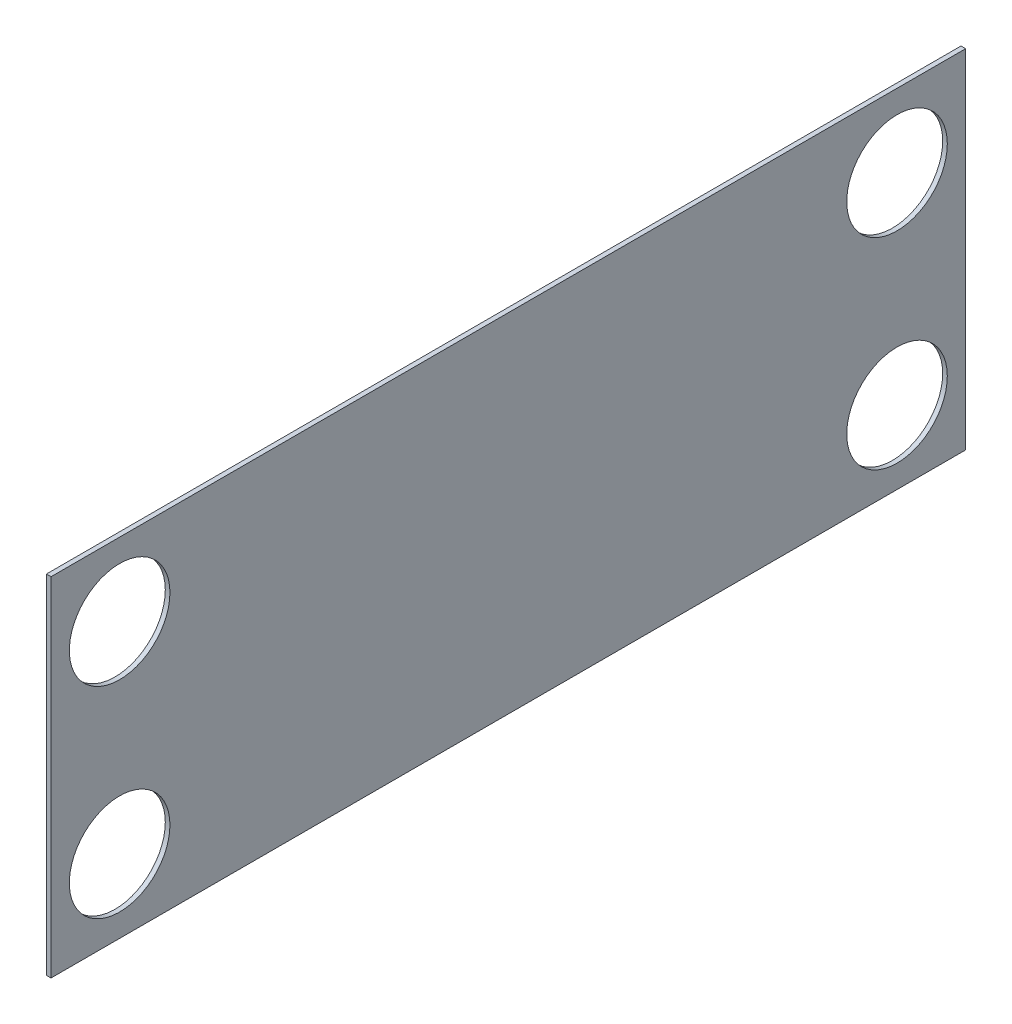
ISO-10303-21;
HEADER;
FILE_DESCRIPTION(('STEP AP214'),'2;1');
FILE_NAME('part.step','',(''),(''),'','','');
FILE_SCHEMA(('AUTOMOTIVE_DESIGN { 1 0 10303 214 1 1 1 1 }'));
ENDSEC;
DATA;
#1=APPLICATION_CONTEXT('core data for automotive mechanical design processes');
#2=APPLICATION_PROTOCOL_DEFINITION('international standard','automotive_design',2000,#1);
#3=PRODUCT_CONTEXT('',#1,'mechanical');
#4=PRODUCT('Part','Part','',(#3));
#5=PRODUCT_RELATED_PRODUCT_CATEGORY('part','',(#4));
#6=PRODUCT_DEFINITION_FORMATION('','',#4);
#7=PRODUCT_DEFINITION_CONTEXT('part definition',#1,'design');
#8=PRODUCT_DEFINITION('design','',#6,#7);
#9=PRODUCT_DEFINITION_SHAPE('','',#8);
#10=(LENGTH_UNIT() NAMED_UNIT(*) SI_UNIT(.MILLI.,.METRE.));
#11=(NAMED_UNIT(*) PLANE_ANGLE_UNIT() SI_UNIT($,.RADIAN.));
#12=(NAMED_UNIT(*) SI_UNIT($,.STERADIAN.) SOLID_ANGLE_UNIT());
#13=UNCERTAINTY_MEASURE_WITH_UNIT(LENGTH_MEASURE(1.E-05),#10,'distance_accuracy_value','');
#14=(GEOMETRIC_REPRESENTATION_CONTEXT(3) GLOBAL_UNCERTAINTY_ASSIGNED_CONTEXT((#13)) GLOBAL_UNIT_ASSIGNED_CONTEXT((#10,
#11,#12)) REPRESENTATION_CONTEXT('',''));
#15=CARTESIAN_POINT('',(0.,0.,0.));
#16=DIRECTION('',(0.,0.,1.));
#17=DIRECTION('',(1.,0.,0.));
#18=AXIS2_PLACEMENT_3D('',#15,#16,#17);
#19=CARTESIAN_POINT('',(0.508,19.,50.));
#20=DIRECTION('',(0.,0.,-1.));
#21=DIRECTION('',(-1.,0.,0.));
#22=AXIS2_PLACEMENT_3D('',#19,#20,#21);
#23=PLANE('',#22);
#24=DIRECTION('',(0.,-1.,0.));
#25=VECTOR('',#24,1.);
#26=CARTESIAN_POINT('',(0.,19.,50.));
#27=LINE('',#26,#25);
#28=CARTESIAN_POINT('',(0.,19.,50.));
#29=VERTEX_POINT('',#28);
#30=CARTESIAN_POINT('',(0.,-19.,50.));
#31=VERTEX_POINT('',#30);
#32=EDGE_CURVE('E97',#29,#31,#27,.T.);
#33=ORIENTED_EDGE('',*,*,#32,.T.);
#34=DIRECTION('',(-1.,0.,0.));
#35=VECTOR('',#34,1.);
#36=CARTESIAN_POINT('',(0.508,-19.,50.));
#37=LINE('',#36,#35);
#38=CARTESIAN_POINT('',(0.508,-19.,50.));
#39=VERTEX_POINT('',#38);
#40=EDGE_CURVE('E11',#39,#31,#37,.T.);
#41=ORIENTED_EDGE('',*,*,#40,.F.);
#42=DIRECTION('',(0.,-1.,0.));
#43=VECTOR('',#42,1.);
#44=CARTESIAN_POINT('',(0.508,19.,50.));
#45=LINE('',#44,#43);
#46=CARTESIAN_POINT('',(0.508,19.,50.));
#47=VERTEX_POINT('',#46);
#48=EDGE_CURVE('E85',#47,#39,#45,.T.);
#49=ORIENTED_EDGE('',*,*,#48,.F.);
#50=DIRECTION('',(-1.,0.,0.));
#51=VECTOR('',#50,1.);
#52=CARTESIAN_POINT('',(0.508,19.,50.));
#53=LINE('',#52,#51);
#54=EDGE_CURVE('E93',#47,#29,#53,.T.);
#55=ORIENTED_EDGE('',*,*,#54,.T.);
#56=EDGE_LOOP('',(#33,#41,#49,#55));
#57=FACE_BOUND('',#56,.T.);
#58=ADVANCED_FACE('F34',(#57),#23,.F.);
#59=CARTESIAN_POINT('',(0.508,-19.,50.));
#60=DIRECTION('',(0.,1.,0.));
#61=DIRECTION('',(0.,0.,1.));
#62=AXIS2_PLACEMENT_3D('',#59,#60,#61);
#63=PLANE('',#62);
#64=DIRECTION('',(0.,0.,-1.));
#65=VECTOR('',#64,1.);
#66=CARTESIAN_POINT('',(0.,-19.,50.));
#67=LINE('',#66,#65);
#68=CARTESIAN_POINT('',(0.,-19.,-50.));
#69=VERTEX_POINT('',#68);
#70=EDGE_CURVE('E89',#31,#69,#67,.T.);
#71=ORIENTED_EDGE('',*,*,#70,.T.);
#72=DIRECTION('',(-1.,0.,0.));
#73=VECTOR('',#72,1.);
#74=CARTESIAN_POINT('',(0.508,-19.,-50.));
#75=LINE('',#74,#73);
#76=CARTESIAN_POINT('',(0.508,-19.,-50.));
#77=VERTEX_POINT('',#76);
#78=EDGE_CURVE('E42',#77,#69,#75,.T.);
#79=ORIENTED_EDGE('',*,*,#78,.F.);
#80=DIRECTION('',(0.,0.,-1.));
#81=VECTOR('',#80,1.);
#82=CARTESIAN_POINT('',(0.508,-19.,50.));
#83=LINE('',#82,#81);
#84=EDGE_CURVE('E80',#39,#77,#83,.T.);
#85=ORIENTED_EDGE('',*,*,#84,.F.);
#86=ORIENTED_EDGE('',*,*,#40,.T.);
#87=EDGE_LOOP('',(#71,#79,#85,#86));
#88=FACE_BOUND('',#87,.T.);
#89=ADVANCED_FACE('F88',(#88),#63,.F.);
#90=CARTESIAN_POINT('',(0.508,19.,-50.));
#91=DIRECTION('',(0.,0.,1.));
#92=DIRECTION('',(1.,0.,0.));
#93=AXIS2_PLACEMENT_3D('',#90,#91,#92);
#94=PLANE('',#93);
#95=DIRECTION('',(0.,1.,0.));
#96=VECTOR('',#95,1.);
#97=CARTESIAN_POINT('',(0.,19.,-50.));
#98=LINE('',#97,#96);
#99=CARTESIAN_POINT('',(0.,19.,-50.));
#100=VERTEX_POINT('',#99);
#101=EDGE_CURVE('E67',#69,#100,#98,.T.);
#102=ORIENTED_EDGE('',*,*,#101,.T.);
#103=DIRECTION('',(-1.,0.,0.));
#104=VECTOR('',#103,1.);
#105=CARTESIAN_POINT('',(0.508,19.,-50.));
#106=LINE('',#105,#104);
#107=CARTESIAN_POINT('',(0.508,19.,-50.));
#108=VERTEX_POINT('',#107);
#109=EDGE_CURVE('E90',#108,#100,#106,.T.);
#110=ORIENTED_EDGE('',*,*,#109,.F.);
#111=DIRECTION('',(0.,1.,0.));
#112=VECTOR('',#111,1.);
#113=CARTESIAN_POINT('',(0.508,19.,-50.));
#114=LINE('',#113,#112);
#115=EDGE_CURVE('E83',#77,#108,#114,.T.);
#116=ORIENTED_EDGE('',*,*,#115,.F.);
#117=ORIENTED_EDGE('',*,*,#78,.T.);
#118=EDGE_LOOP('',(#102,#110,#116,#117));
#119=FACE_BOUND('',#118,.T.);
#120=ADVANCED_FACE('F91',(#119),#94,.F.);
#121=CARTESIAN_POINT('',(0.508,19.,50.));
#122=DIRECTION('',(0.,-1.,0.));
#123=DIRECTION('',(0.,0.,-1.));
#124=AXIS2_PLACEMENT_3D('',#121,#122,#123);
#125=PLANE('',#124);
#126=DIRECTION('',(0.,0.,1.));
#127=VECTOR('',#126,1.);
#128=CARTESIAN_POINT('',(0.,19.,50.));
#129=LINE('',#128,#127);
#130=EDGE_CURVE('E73',#100,#29,#129,.T.);
#131=ORIENTED_EDGE('',*,*,#130,.T.);
#132=ORIENTED_EDGE('',*,*,#54,.F.);
#133=DIRECTION('',(0.,0.,1.));
#134=VECTOR('',#133,1.);
#135=CARTESIAN_POINT('',(0.508,19.,50.));
#136=LINE('',#135,#134);
#137=EDGE_CURVE('E50',#108,#47,#136,.T.);
#138=ORIENTED_EDGE('',*,*,#137,.F.);
#139=ORIENTED_EDGE('',*,*,#109,.T.);
#140=EDGE_LOOP('',(#131,#132,#138,#139));
#141=FACE_BOUND('',#140,.T.);
#142=ADVANCED_FACE('F105',(#141),#125,.F.);
#143=CARTESIAN_POINT('',(0.508,0.,0.));
#144=DIRECTION('',(1.,0.,0.));
#145=DIRECTION('',(0.,0.,-1.));
#146=AXIS2_PLACEMENT_3D('',#143,#144,#145);
#147=PLANE('',#146);
#148=CARTESIAN_POINT('',(0.508000000000001,11.,42.5));
#149=DIRECTION('',(1.,0.,0.));
#150=DIRECTION('',(0.,0.,-1.));
#151=AXIS2_PLACEMENT_3D('',#148,#149,#150);
#152=CIRCLE('',#151,5.49999999999999);
#153=CARTESIAN_POINT('',(0.508000000000001,11.,37.));
#154=VERTEX_POINT('',#153);
#155=EDGE_CURVE('E131',#154,#154,#152,.T.);
#156=ORIENTED_EDGE('',*,*,#155,.F.);
#157=EDGE_LOOP('',(#156));
#158=FACE_BOUND('',#157,.T.);
#159=CARTESIAN_POINT('',(0.508000000000001,-11.,42.5));
#160=DIRECTION('',(1.,0.,0.));
#161=DIRECTION('',(0.,0.,-1.));
#162=AXIS2_PLACEMENT_3D('',#159,#160,#161);
#163=CIRCLE('',#162,5.49999999999999);
#164=CARTESIAN_POINT('',(0.508000000000001,-11.,37.));
#165=VERTEX_POINT('',#164);
#166=EDGE_CURVE('E125',#165,#165,#163,.T.);
#167=ORIENTED_EDGE('',*,*,#166,.F.);
#168=EDGE_LOOP('',(#167));
#169=FACE_BOUND('',#168,.T.);
#170=CARTESIAN_POINT('',(0.508000000000001,11.,-42.5));
#171=DIRECTION('',(1.,0.,0.));
#172=DIRECTION('',(0.,0.,-1.));
#173=AXIS2_PLACEMENT_3D('',#170,#171,#172);
#174=CIRCLE('',#173,5.49999999999999);
#175=CARTESIAN_POINT('',(0.508000000000001,11.,-48.));
#176=VERTEX_POINT('',#175);
#177=EDGE_CURVE('E119',#176,#176,#174,.T.);
#178=ORIENTED_EDGE('',*,*,#177,.F.);
#179=EDGE_LOOP('',(#178));
#180=FACE_BOUND('',#179,.T.);
#181=CARTESIAN_POINT('',(0.508000000000001,-11.,-42.5));
#182=DIRECTION('',(1.,0.,0.));
#183=DIRECTION('',(0.,0.,-1.));
#184=AXIS2_PLACEMENT_3D('',#181,#182,#183);
#185=CIRCLE('',#184,5.49999999999999);
#186=CARTESIAN_POINT('',(0.508000000000001,-11.,-48.));
#187=VERTEX_POINT('',#186);
#188=EDGE_CURVE('E113',#187,#187,#185,.T.);
#189=ORIENTED_EDGE('',*,*,#188,.F.);
#190=EDGE_LOOP('',(#189));
#191=FACE_BOUND('',#190,.T.);
#192=ORIENTED_EDGE('',*,*,#48,.T.);
#193=ORIENTED_EDGE('',*,*,#84,.T.);
#194=ORIENTED_EDGE('',*,*,#115,.T.);
#195=ORIENTED_EDGE('',*,*,#137,.T.);
#196=EDGE_LOOP('',(#192,#193,#194,#195));
#197=FACE_BOUND('',#196,.T.);
#198=ADVANCED_FACE('F81',(#158,#169,#180,#191,#197),#147,.T.);
#199=CARTESIAN_POINT('',(0.,0.,0.));
#200=DIRECTION('',(1.,0.,0.));
#201=DIRECTION('',(0.,0.,-1.));
#202=AXIS2_PLACEMENT_3D('',#199,#200,#201);
#203=PLANE('',#202);
#204=CARTESIAN_POINT('',(0.,11.,42.5));
#205=DIRECTION('',(1.,0.,0.));
#206=DIRECTION('',(0.,0.,-1.));
#207=AXIS2_PLACEMENT_3D('',#204,#205,#206);
#208=CIRCLE('',#207,5.49999999999999);
#209=CARTESIAN_POINT('',(0.,11.,37.));
#210=VERTEX_POINT('',#209);
#211=EDGE_CURVE('E128',#210,#210,#208,.T.);
#212=ORIENTED_EDGE('',*,*,#211,.T.);
#213=EDGE_LOOP('',(#212));
#214=FACE_BOUND('',#213,.T.);
#215=CARTESIAN_POINT('',(0.,-11.,42.5));
#216=DIRECTION('',(1.,0.,0.));
#217=DIRECTION('',(0.,0.,-1.));
#218=AXIS2_PLACEMENT_3D('',#215,#216,#217);
#219=CIRCLE('',#218,5.5);
#220=CARTESIAN_POINT('',(0.,-11.,37.));
#221=VERTEX_POINT('',#220);
#222=EDGE_CURVE('E122',#221,#221,#219,.T.);
#223=ORIENTED_EDGE('',*,*,#222,.T.);
#224=EDGE_LOOP('',(#223));
#225=FACE_BOUND('',#224,.T.);
#226=CARTESIAN_POINT('',(0.,11.,-42.5));
#227=DIRECTION('',(1.,0.,0.));
#228=DIRECTION('',(0.,0.,-1.));
#229=AXIS2_PLACEMENT_3D('',#226,#227,#228);
#230=CIRCLE('',#229,5.49999999999999);
#231=CARTESIAN_POINT('',(0.,11.,-48.));
#232=VERTEX_POINT('',#231);
#233=EDGE_CURVE('E116',#232,#232,#230,.T.);
#234=ORIENTED_EDGE('',*,*,#233,.T.);
#235=EDGE_LOOP('',(#234));
#236=FACE_BOUND('',#235,.T.);
#237=CARTESIAN_POINT('',(0.,-11.,-42.5));
#238=DIRECTION('',(1.,0.,0.));
#239=DIRECTION('',(0.,0.,-1.));
#240=AXIS2_PLACEMENT_3D('',#237,#238,#239);
#241=CIRCLE('',#240,5.5);
#242=CARTESIAN_POINT('',(0.,-11.,-48.));
#243=VERTEX_POINT('',#242);
#244=EDGE_CURVE('E100',#243,#243,#241,.T.);
#245=ORIENTED_EDGE('',*,*,#244,.T.);
#246=EDGE_LOOP('',(#245));
#247=FACE_BOUND('',#246,.T.);
#248=ORIENTED_EDGE('',*,*,#32,.F.);
#249=ORIENTED_EDGE('',*,*,#130,.F.);
#250=ORIENTED_EDGE('',*,*,#101,.F.);
#251=ORIENTED_EDGE('',*,*,#70,.F.);
#252=EDGE_LOOP('',(#248,#249,#250,#251));
#253=FACE_BOUND('',#252,.T.);
#254=ADVANCED_FACE('F108',(#214,#225,#236,#247,#253),#203,.F.);
#255=CARTESIAN_POINT('',(0.508,-11.,-42.5));
#256=DIRECTION('',(1.,0.,0.));
#257=DIRECTION('',(0.,0.,-1.));
#258=AXIS2_PLACEMENT_3D('',#255,#256,#257);
#259=CYLINDRICAL_SURFACE('',#258,5.49999999999999);
#260=ORIENTED_EDGE('',*,*,#244,.F.);
#261=EDGE_LOOP('',(#260));
#262=FACE_BOUND('',#261,.T.);
#263=ORIENTED_EDGE('',*,*,#188,.T.);
#264=EDGE_LOOP('',(#263));
#265=FACE_BOUND('',#264,.T.);
#266=ADVANCED_FACE('F146',(#262,#265),#259,.F.);
#267=CARTESIAN_POINT('',(0.508,11.,-42.5));
#268=DIRECTION('',(1.,0.,0.));
#269=DIRECTION('',(0.,0.,-1.));
#270=AXIS2_PLACEMENT_3D('',#267,#268,#269);
#271=CYLINDRICAL_SURFACE('',#270,5.49999999999999);
#272=ORIENTED_EDGE('',*,*,#233,.F.);
#273=EDGE_LOOP('',(#272));
#274=FACE_BOUND('',#273,.T.);
#275=ORIENTED_EDGE('',*,*,#177,.T.);
#276=EDGE_LOOP('',(#275));
#277=FACE_BOUND('',#276,.T.);
#278=ADVANCED_FACE('F148',(#274,#277),#271,.F.);
#279=CARTESIAN_POINT('',(0.508,-11.,42.5));
#280=DIRECTION('',(1.,0.,0.));
#281=DIRECTION('',(0.,0.,-1.));
#282=AXIS2_PLACEMENT_3D('',#279,#280,#281);
#283=CYLINDRICAL_SURFACE('',#282,5.49999999999999);
#284=ORIENTED_EDGE('',*,*,#222,.F.);
#285=EDGE_LOOP('',(#284));
#286=FACE_BOUND('',#285,.T.);
#287=ORIENTED_EDGE('',*,*,#166,.T.);
#288=EDGE_LOOP('',(#287));
#289=FACE_BOUND('',#288,.T.);
#290=ADVANCED_FACE('F155',(#286,#289),#283,.F.);
#291=CARTESIAN_POINT('',(0.508,11.,42.5));
#292=DIRECTION('',(1.,0.,0.));
#293=DIRECTION('',(0.,0.,-1.));
#294=AXIS2_PLACEMENT_3D('',#291,#292,#293);
#295=CYLINDRICAL_SURFACE('',#294,5.49999999999999);
#296=ORIENTED_EDGE('',*,*,#211,.F.);
#297=EDGE_LOOP('',(#296));
#298=FACE_BOUND('',#297,.T.);
#299=ORIENTED_EDGE('',*,*,#155,.T.);
#300=EDGE_LOOP('',(#299));
#301=FACE_BOUND('',#300,.T.);
#302=ADVANCED_FACE('F135',(#298,#301),#295,.F.);
#303=CLOSED_SHELL('',(#58,#89,#120,#142,#198,#254,#266,#278,#290,#302));
#304=MANIFOLD_SOLID_BREP('B2',#303);
#305=ADVANCED_BREP_SHAPE_REPRESENTATION('',(#18,#304),#14);
#306=SHAPE_DEFINITION_REPRESENTATION(#9,#305);
ENDSEC;
END-ISO-10303-21;
